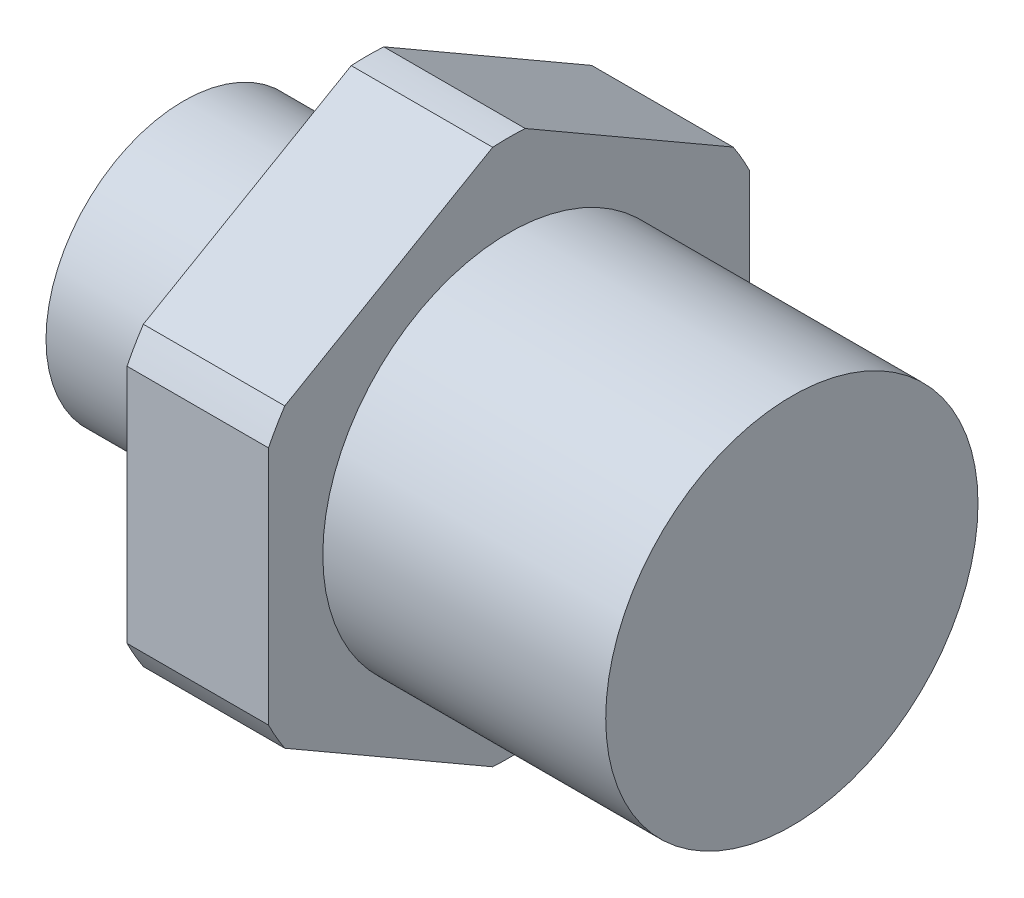
ISO-10303-21;
HEADER;
FILE_DESCRIPTION(('STEP AP214'),'2;1');
FILE_NAME('part.step','',(''),(''),'','','');
FILE_SCHEMA(('AUTOMOTIVE_DESIGN { 1 0 10303 214 1 1 1 1 }'));
ENDSEC;
DATA;
#1=APPLICATION_CONTEXT('core data for automotive mechanical design processes');
#2=APPLICATION_PROTOCOL_DEFINITION('international standard','automotive_design',2000,#1);
#3=PRODUCT_CONTEXT('',#1,'mechanical');
#4=PRODUCT('Part','Part','',(#3));
#5=PRODUCT_RELATED_PRODUCT_CATEGORY('part','',(#4));
#6=PRODUCT_DEFINITION_FORMATION('','',#4);
#7=PRODUCT_DEFINITION_CONTEXT('part definition',#1,'design');
#8=PRODUCT_DEFINITION('design','',#6,#7);
#9=PRODUCT_DEFINITION_SHAPE('','',#8);
#10=(LENGTH_UNIT() NAMED_UNIT(*) SI_UNIT(.MILLI.,.METRE.));
#11=(NAMED_UNIT(*) PLANE_ANGLE_UNIT() SI_UNIT($,.RADIAN.));
#12=(NAMED_UNIT(*) SI_UNIT($,.STERADIAN.) SOLID_ANGLE_UNIT());
#13=UNCERTAINTY_MEASURE_WITH_UNIT(LENGTH_MEASURE(1.E-05),#10,'distance_accuracy_value','');
#14=(GEOMETRIC_REPRESENTATION_CONTEXT(3) GLOBAL_UNCERTAINTY_ASSIGNED_CONTEXT((#13)) GLOBAL_UNIT_ASSIGNED_CONTEXT((#10,
#11,#12)) REPRESENTATION_CONTEXT('',''));
#15=CARTESIAN_POINT('',(0.,0.,0.));
#16=DIRECTION('',(0.,0.,1.));
#17=DIRECTION('',(1.,0.,0.));
#18=AXIS2_PLACEMENT_3D('',#15,#16,#17);
#19=CARTESIAN_POINT('',(0.,0.,0.));
#20=DIRECTION('',(1.,0.,0.));
#21=DIRECTION('',(0.,0.,-1.));
#22=AXIS2_PLACEMENT_3D('',#19,#20,#21);
#23=CYLINDRICAL_SURFACE('',#22,9.5);
#24=DIRECTION('',(1.,0.,0.));
#25=VECTOR('',#24,1.);
#26=CARTESIAN_POINT('',(-15.,-4.24264068711928,8.5));
#27=LINE('',#26,#25);
#28=CARTESIAN_POINT('',(-15.,-4.24264068711928,8.5));
#29=VERTEX_POINT('',#28);
#30=CARTESIAN_POINT('',(-10.,-4.24264068711928,8.5));
#31=VERTEX_POINT('',#30);
#32=EDGE_CURVE('E107',#29,#31,#27,.T.);
#33=ORIENTED_EDGE('',*,*,#32,.F.);
#34=CARTESIAN_POINT('',(-15.,0.,0.));
#35=DIRECTION('',(1.,0.,0.));
#36=DIRECTION('',(0.,-0.446593756538872,0.894736842105263));
#37=AXIS2_PLACEMENT_3D('',#34,#35,#36);
#38=CIRCLE('',#37,9.5);
#39=CARTESIAN_POINT('',(-15.,-5.23989558860806,7.92423461417479));
#40=VERTEX_POINT('',#39);
#41=EDGE_CURVE('E122',#29,#40,#38,.T.);
#42=ORIENTED_EDGE('',*,*,#41,.T.);
#43=DIRECTION('',(-1.,0.,0.));
#44=VECTOR('',#43,1.);
#45=CARTESIAN_POINT('',(-10.,-5.23989558860806,7.92423461417479));
#46=LINE('',#45,#44);
#47=CARTESIAN_POINT('',(-10.,-5.23989558860806,7.92423461417479));
#48=VERTEX_POINT('',#47);
#49=EDGE_CURVE('E128',#48,#40,#46,.T.);
#50=ORIENTED_EDGE('',*,*,#49,.F.);
#51=CARTESIAN_POINT('',(-10.,0.,0.));
#52=DIRECTION('',(1.,0.,0.));
#53=DIRECTION('',(0.,-0.446593756538872,0.894736842105263));
#54=AXIS2_PLACEMENT_3D('',#51,#52,#53);
#55=CIRCLE('',#54,9.5);
#56=EDGE_CURVE('E124',#31,#48,#55,.T.);
#57=ORIENTED_EDGE('',*,*,#56,.F.);
#58=EDGE_LOOP('',(#33,#42,#50,#57));
#59=FACE_BOUND('',#58,.T.);
#60=ADVANCED_FACE('F17',(#59),#23,.T.);
#61=DIRECTION('',(-1.,0.,0.));
#62=VECTOR('',#61,1.);
#63=CARTESIAN_POINT('',(-10.,4.24264068711928,8.5));
#64=LINE('',#63,#62);
#65=CARTESIAN_POINT('',(-10.,4.24264068711928,8.5));
#66=VERTEX_POINT('',#65);
#67=CARTESIAN_POINT('',(-15.,4.24264068711928,8.5));
#68=VERTEX_POINT('',#67);
#69=EDGE_CURVE('E110',#66,#68,#64,.T.);
#70=ORIENTED_EDGE('',*,*,#69,.F.);
#71=CARTESIAN_POINT('',(-10.,0.,0.));
#72=DIRECTION('',(1.,0.,0.));
#73=DIRECTION('',(0.,0.551567956695585,0.834129959386819));
#74=AXIS2_PLACEMENT_3D('',#71,#72,#73);
#75=CIRCLE('',#74,9.5);
#76=CARTESIAN_POINT('',(-10.,5.23989558860806,7.92423461417479));
#77=VERTEX_POINT('',#76);
#78=EDGE_CURVE('E142',#77,#66,#75,.T.);
#79=ORIENTED_EDGE('',*,*,#78,.F.);
#80=DIRECTION('',(1.,0.,0.));
#81=VECTOR('',#80,1.);
#82=CARTESIAN_POINT('',(-15.,5.23989558860806,7.92423461417479));
#83=LINE('',#82,#81);
#84=CARTESIAN_POINT('',(-15.,5.23989558860805,7.92423461417479));
#85=VERTEX_POINT('',#84);
#86=EDGE_CURVE('E147',#85,#77,#83,.T.);
#87=ORIENTED_EDGE('',*,*,#86,.F.);
#88=CARTESIAN_POINT('',(-15.,0.,0.));
#89=DIRECTION('',(1.,0.,0.));
#90=DIRECTION('',(0.,0.551567956695585,0.83412995938682));
#91=AXIS2_PLACEMENT_3D('',#88,#89,#90);
#92=CIRCLE('',#91,9.5);
#93=EDGE_CURVE('E151',#85,#68,#92,.T.);
#94=ORIENTED_EDGE('',*,*,#93,.T.);
#95=EDGE_LOOP('',(#70,#79,#87,#94));
#96=FACE_BOUND('',#95,.T.);
#97=ADVANCED_FACE('F296',(#96),#23,.T.);
#98=DIRECTION('',(-1.,0.,0.));
#99=VECTOR('',#98,1.);
#100=CARTESIAN_POINT('',(-10.,9.48253627572737,0.575765385825165));
#101=LINE('',#100,#99);
#102=CARTESIAN_POINT('',(-10.,9.48253627572737,0.575765385825165));
#103=VERTEX_POINT('',#102);
#104=CARTESIAN_POINT('',(-15.,9.48253627572737,0.575765385825161));
#105=VERTEX_POINT('',#104);
#106=EDGE_CURVE('E155',#103,#105,#101,.T.);
#107=ORIENTED_EDGE('',*,*,#106,.F.);
#108=CARTESIAN_POINT('',(-10.,0.,0.));
#109=DIRECTION('',(1.,0.,0.));
#110=DIRECTION('',(0.,0.998161713234461,-0.0606068827184386));
#111=AXIS2_PLACEMENT_3D('',#108,#109,#110);
#112=CIRCLE('',#111,9.5);
#113=CARTESIAN_POINT('',(-10.,9.48253627572737,-0.575765385825165));
#114=VERTEX_POINT('',#113);
#115=EDGE_CURVE('E159',#114,#103,#112,.T.);
#116=ORIENTED_EDGE('',*,*,#115,.F.);
#117=DIRECTION('',(1.,0.,0.));
#118=VECTOR('',#117,1.);
#119=CARTESIAN_POINT('',(-15.,9.48253627572737,-0.575765385825165));
#120=LINE('',#119,#118);
#121=CARTESIAN_POINT('',(-15.,9.48253627572737,-0.575765385825161));
#122=VERTEX_POINT('',#121);
#123=EDGE_CURVE('E164',#122,#114,#120,.T.);
#124=ORIENTED_EDGE('',*,*,#123,.F.);
#125=CARTESIAN_POINT('',(-15.,0.,0.));
#126=DIRECTION('',(1.,0.,0.));
#127=DIRECTION('',(0.,0.998161713234461,-0.0606068827184381));
#128=AXIS2_PLACEMENT_3D('',#125,#126,#127);
#129=CIRCLE('',#128,9.5);
#130=EDGE_CURVE('E168',#122,#105,#129,.T.);
#131=ORIENTED_EDGE('',*,*,#130,.T.);
#132=EDGE_LOOP('',(#107,#116,#124,#131));
#133=FACE_BOUND('',#132,.T.);
#134=ADVANCED_FACE('F305',(#133),#23,.T.);
#135=DIRECTION('',(-1.,0.,0.));
#136=VECTOR('',#135,1.);
#137=CARTESIAN_POINT('',(-10.,5.23989558860806,-7.92423461417479));
#138=LINE('',#137,#136);
#139=CARTESIAN_POINT('',(-10.,5.23989558860806,-7.92423461417479));
#140=VERTEX_POINT('',#139);
#141=CARTESIAN_POINT('',(-15.,5.23989558860805,-7.92423461417479));
#142=VERTEX_POINT('',#141);
#143=EDGE_CURVE('E173',#140,#142,#138,.T.);
#144=ORIENTED_EDGE('',*,*,#143,.F.);
#145=CARTESIAN_POINT('',(-10.,0.,0.));
#146=DIRECTION('',(1.,0.,0.));
#147=DIRECTION('',(0.,0.446593756538872,-0.894736842105263));
#148=AXIS2_PLACEMENT_3D('',#145,#146,#147);
#149=CIRCLE('',#148,9.5);
#150=CARTESIAN_POINT('',(-10.,4.24264068711928,-8.5));
#151=VERTEX_POINT('',#150);
#152=EDGE_CURVE('E177',#151,#140,#149,.T.);
#153=ORIENTED_EDGE('',*,*,#152,.F.);
#154=DIRECTION('',(1.,0.,0.));
#155=VECTOR('',#154,1.);
#156=CARTESIAN_POINT('',(-15.,4.24264068711928,-8.5));
#157=LINE('',#156,#155);
#158=CARTESIAN_POINT('',(-15.,4.24264068711928,-8.5));
#159=VERTEX_POINT('',#158);
#160=EDGE_CURVE('E182',#159,#151,#157,.T.);
#161=ORIENTED_EDGE('',*,*,#160,.F.);
#162=CARTESIAN_POINT('',(-15.,0.,0.));
#163=DIRECTION('',(1.,0.,0.));
#164=DIRECTION('',(0.,0.446593756538872,-0.894736842105263));
#165=AXIS2_PLACEMENT_3D('',#162,#163,#164);
#166=CIRCLE('',#165,9.5);
#167=EDGE_CURVE('E186',#159,#142,#166,.T.);
#168=ORIENTED_EDGE('',*,*,#167,.T.);
#169=EDGE_LOOP('',(#144,#153,#161,#168));
#170=FACE_BOUND('',#169,.T.);
#171=ADVANCED_FACE('F315',(#170),#23,.T.);
#172=DIRECTION('',(-1.,0.,0.));
#173=VECTOR('',#172,1.);
#174=CARTESIAN_POINT('',(-10.,-4.24264068711928,-8.5));
#175=LINE('',#174,#173);
#176=CARTESIAN_POINT('',(-10.,-4.24264068711928,-8.5));
#177=VERTEX_POINT('',#176);
#178=CARTESIAN_POINT('',(-15.,-4.24264068711928,-8.5));
#179=VERTEX_POINT('',#178);
#180=EDGE_CURVE('E191',#177,#179,#175,.T.);
#181=ORIENTED_EDGE('',*,*,#180,.F.);
#182=CARTESIAN_POINT('',(-10.,0.,0.));
#183=DIRECTION('',(1.,0.,0.));
#184=DIRECTION('',(0.,-0.551567956695586,-0.834129959386819));
#185=AXIS2_PLACEMENT_3D('',#182,#183,#184);
#186=CIRCLE('',#185,9.5);
#187=CARTESIAN_POINT('',(-10.,-5.23989558860806,-7.92423461417479));
#188=VERTEX_POINT('',#187);
#189=EDGE_CURVE('E195',#188,#177,#186,.T.);
#190=ORIENTED_EDGE('',*,*,#189,.F.);
#191=DIRECTION('',(1.,0.,0.));
#192=VECTOR('',#191,1.);
#193=CARTESIAN_POINT('',(-15.,-5.23989558860806,-7.92423461417479));
#194=LINE('',#193,#192);
#195=CARTESIAN_POINT('',(-15.,-5.23989558860806,-7.92423461417479));
#196=VERTEX_POINT('',#195);
#197=EDGE_CURVE('E200',#196,#188,#194,.T.);
#198=ORIENTED_EDGE('',*,*,#197,.F.);
#199=CARTESIAN_POINT('',(-15.,0.,0.));
#200=DIRECTION('',(1.,0.,0.));
#201=DIRECTION('',(0.,-0.551567956695586,-0.834129959386819));
#202=AXIS2_PLACEMENT_3D('',#199,#200,#201);
#203=CIRCLE('',#202,9.5);
#204=EDGE_CURVE('E204',#196,#179,#203,.T.);
#205=ORIENTED_EDGE('',*,*,#204,.T.);
#206=EDGE_LOOP('',(#181,#190,#198,#205));
#207=FACE_BOUND('',#206,.T.);
#208=ADVANCED_FACE('F323',(#207),#23,.T.);
#209=DIRECTION('',(-1.,0.,0.));
#210=VECTOR('',#209,1.);
#211=CARTESIAN_POINT('',(-10.,-9.48253627572737,-0.575765385825165));
#212=LINE('',#211,#210);
#213=CARTESIAN_POINT('',(-10.,-9.48253627572737,-0.575765385825165));
#214=VERTEX_POINT('',#213);
#215=CARTESIAN_POINT('',(-15.,-9.48253627572737,-0.575765385825168));
#216=VERTEX_POINT('',#215);
#217=EDGE_CURVE('E32',#214,#216,#212,.T.);
#218=ORIENTED_EDGE('',*,*,#217,.F.);
#219=CARTESIAN_POINT('',(-10.,0.,0.));
#220=DIRECTION('',(1.,0.,0.));
#221=DIRECTION('',(0.,-0.998161713234461,0.0606068827184389));
#222=AXIS2_PLACEMENT_3D('',#219,#220,#221);
#223=CIRCLE('',#222,9.5);
#224=CARTESIAN_POINT('',(-10.,-9.48253627572737,0.575765385825165));
#225=VERTEX_POINT('',#224);
#226=EDGE_CURVE('E212',#225,#214,#223,.T.);
#227=ORIENTED_EDGE('',*,*,#226,.F.);
#228=DIRECTION('',(1.,0.,0.));
#229=VECTOR('',#228,1.);
#230=CARTESIAN_POINT('',(-15.,-9.48253627572737,0.575765385825165));
#231=LINE('',#230,#229);
#232=CARTESIAN_POINT('',(-15.,-9.48253627572737,0.575765385825165));
#233=VERTEX_POINT('',#232);
#234=EDGE_CURVE('E217',#233,#225,#231,.T.);
#235=ORIENTED_EDGE('',*,*,#234,.F.);
#236=CARTESIAN_POINT('',(-15.,0.,0.));
#237=DIRECTION('',(1.,0.,0.));
#238=DIRECTION('',(0.,-0.998161713234461,0.0606068827184389));
#239=AXIS2_PLACEMENT_3D('',#236,#237,#238);
#240=CIRCLE('',#239,9.5);
#241=EDGE_CURVE('E221',#233,#216,#240,.T.);
#242=ORIENTED_EDGE('',*,*,#241,.T.);
#243=EDGE_LOOP('',(#218,#227,#235,#242));
#244=FACE_BOUND('',#243,.T.);
#245=ADVANCED_FACE('F290',(#244),#23,.T.);
#246=CARTESIAN_POINT('',(-10.,9.5,0.));
#247=DIRECTION('',(-1.,0.,0.));
#248=DIRECTION('',(0.,0.,1.));
#249=AXIS2_PLACEMENT_3D('',#246,#247,#248);
#250=PLANE('',#249);
#251=CARTESIAN_POINT('',(-10.,0.,0.));
#252=DIRECTION('',(1.,0.,0.));
#253=DIRECTION('',(0.,0.,-1.));
#254=AXIS2_PLACEMENT_3D('',#251,#252,#253);
#255=CIRCLE('',#254,6.58);
#256=CARTESIAN_POINT('',(-10.,0.,-6.58));
#257=VERTEX_POINT('',#256);
#258=EDGE_CURVE('E226',#257,#257,#255,.T.);
#259=ORIENTED_EDGE('',*,*,#258,.F.);
#260=EDGE_LOOP('',(#259));
#261=FACE_BOUND('',#260,.T.);
#262=DIRECTION('',(0.,1.,0.));
#263=VECTOR('',#262,1.);
#264=CARTESIAN_POINT('',(-10.,-4.24264068711928,8.5));
#265=LINE('',#264,#263);
#266=EDGE_CURVE('E231',#31,#66,#265,.T.);
#267=ORIENTED_EDGE('',*,*,#266,.F.);
#268=ORIENTED_EDGE('',*,*,#56,.T.);
#269=DIRECTION('',(0.,0.499999999999999,0.866025403784439));
#270=VECTOR('',#269,1.);
#271=CARTESIAN_POINT('',(-10.,-9.48253627572738,0.575765385825172));
#272=LINE('',#271,#270);
#273=EDGE_CURVE('E233',#225,#48,#272,.T.);
#274=ORIENTED_EDGE('',*,*,#273,.F.);
#275=ORIENTED_EDGE('',*,*,#226,.T.);
#276=DIRECTION('',(0.,-0.499999999999999,0.866025403784439));
#277=VECTOR('',#276,1.);
#278=CARTESIAN_POINT('',(-10.,-5.23989558860806,-7.92423461417479));
#279=LINE('',#278,#277);
#280=EDGE_CURVE('E237',#188,#214,#279,.T.);
#281=ORIENTED_EDGE('',*,*,#280,.F.);
#282=ORIENTED_EDGE('',*,*,#189,.T.);
#283=DIRECTION('',(0.,-1.,0.));
#284=VECTOR('',#283,1.);
#285=CARTESIAN_POINT('',(-10.,4.24264068711928,-8.5));
#286=LINE('',#285,#284);
#287=EDGE_CURVE('E241',#151,#177,#286,.T.);
#288=ORIENTED_EDGE('',*,*,#287,.F.);
#289=ORIENTED_EDGE('',*,*,#152,.T.);
#290=DIRECTION('',(0.,-0.499999999999999,-0.866025403784439));
#291=VECTOR('',#290,1.);
#292=CARTESIAN_POINT('',(-10.,9.48253627572737,-0.575765385825167));
#293=LINE('',#292,#291);
#294=EDGE_CURVE('E245',#114,#140,#293,.T.);
#295=ORIENTED_EDGE('',*,*,#294,.F.);
#296=ORIENTED_EDGE('',*,*,#115,.T.);
#297=DIRECTION('',(0.,0.499999999999999,-0.866025403784439));
#298=VECTOR('',#297,1.);
#299=CARTESIAN_POINT('',(-10.,5.23989558860805,7.92423461417478));
#300=LINE('',#299,#298);
#301=EDGE_CURVE('E249',#77,#103,#300,.T.);
#302=ORIENTED_EDGE('',*,*,#301,.F.);
#303=ORIENTED_EDGE('',*,*,#78,.T.);
#304=EDGE_LOOP('',(#267,#268,#274,#275,#281,#282,#288,#289,#295,#296,#302,#303));
#305=FACE_BOUND('',#304,.T.);
#306=ADVANCED_FACE('F287',(#261,#305),#250,.F.);
#307=CARTESIAN_POINT('',(-15.,4.865,0.));
#308=DIRECTION('',(1.,0.,0.));
#309=DIRECTION('',(0.,0.,-1.));
#310=AXIS2_PLACEMENT_3D('',#307,#308,#309);
#311=PLANE('',#310);
#312=CARTESIAN_POINT('',(-15.,0.,0.));
#313=DIRECTION('',(1.,0.,0.));
#314=DIRECTION('',(0.,0.,-1.));
#315=AXIS2_PLACEMENT_3D('',#312,#313,#314);
#316=CIRCLE('',#315,4.865);
#317=CARTESIAN_POINT('',(-15.,0.,-4.865));
#318=VERTEX_POINT('',#317);
#319=EDGE_CURVE('E116',#318,#318,#316,.T.);
#320=ORIENTED_EDGE('',*,*,#319,.T.);
#321=EDGE_LOOP('',(#320));
#322=FACE_BOUND('',#321,.T.);
#323=DIRECTION('',(0.,-1.,0.));
#324=VECTOR('',#323,1.);
#325=CARTESIAN_POINT('',(-15.,4.24264068711929,8.5));
#326=LINE('',#325,#324);
#327=EDGE_CURVE('E105',#68,#29,#326,.T.);
#328=ORIENTED_EDGE('',*,*,#327,.F.);
#329=ORIENTED_EDGE('',*,*,#93,.F.);
#330=DIRECTION('',(0.,-0.5,0.866025403784439));
#331=VECTOR('',#330,1.);
#332=CARTESIAN_POINT('',(-15.,9.48253627572738,0.575765385825167));
#333=LINE('',#332,#331);
#334=EDGE_CURVE('E115',#105,#85,#333,.T.);
#335=ORIENTED_EDGE('',*,*,#334,.F.);
#336=ORIENTED_EDGE('',*,*,#130,.F.);
#337=DIRECTION('',(0.,0.5,0.866025403784439));
#338=VECTOR('',#337,1.);
#339=CARTESIAN_POINT('',(-15.,5.23989558860805,-7.92423461417479));
#340=LINE('',#339,#338);
#341=EDGE_CURVE('E260',#142,#122,#340,.T.);
#342=ORIENTED_EDGE('',*,*,#341,.F.);
#343=ORIENTED_EDGE('',*,*,#167,.F.);
#344=DIRECTION('',(0.,1.,0.));
#345=VECTOR('',#344,1.);
#346=CARTESIAN_POINT('',(-15.,-4.24264068711929,-8.5));
#347=LINE('',#346,#345);
#348=EDGE_CURVE('E264',#179,#159,#347,.T.);
#349=ORIENTED_EDGE('',*,*,#348,.F.);
#350=ORIENTED_EDGE('',*,*,#204,.F.);
#351=DIRECTION('',(0.,0.499999999999999,-0.866025403784439));
#352=VECTOR('',#351,1.);
#353=CARTESIAN_POINT('',(-15.,-9.48253627572738,-0.575765385825171));
#354=LINE('',#353,#352);
#355=EDGE_CURVE('E268',#216,#196,#354,.T.);
#356=ORIENTED_EDGE('',*,*,#355,.F.);
#357=ORIENTED_EDGE('',*,*,#241,.F.);
#358=DIRECTION('',(0.,-0.5,-0.866025403784439));
#359=VECTOR('',#358,1.);
#360=CARTESIAN_POINT('',(-15.,-5.23989558860805,7.92423461417478));
#361=LINE('',#360,#359);
#362=EDGE_CURVE('E40',#40,#233,#361,.T.);
#363=ORIENTED_EDGE('',*,*,#362,.F.);
#364=ORIENTED_EDGE('',*,*,#41,.F.);
#365=EDGE_LOOP('',(#328,#329,#335,#336,#342,#343,#349,#350,#356,#357,#363,#364));
#366=FACE_BOUND('',#365,.T.);
#367=ADVANCED_FACE('F126',(#322,#366),#311,.F.);
#368=CARTESIAN_POINT('',(50.,0.,0.));
#369=DIRECTION('',(1.,0.,0.));
#370=DIRECTION('',(0.,0.,-1.));
#371=AXIS2_PLACEMENT_3D('',#368,#369,#370);
#372=CYLINDRICAL_SURFACE('',#371,6.58);
#373=CARTESIAN_POINT('',(0.,0.,0.));
#374=DIRECTION('',(1.,0.,0.));
#375=DIRECTION('',(0.,0.,-1.));
#376=AXIS2_PLACEMENT_3D('',#373,#374,#375);
#377=CIRCLE('',#376,6.58);
#378=CARTESIAN_POINT('',(0.,0.,-6.58));
#379=VERTEX_POINT('',#378);
#380=EDGE_CURVE('E25',#379,#379,#377,.T.);
#381=ORIENTED_EDGE('',*,*,#380,.F.);
#382=EDGE_LOOP('',(#381));
#383=FACE_BOUND('',#382,.T.);
#384=ORIENTED_EDGE('',*,*,#258,.T.);
#385=EDGE_LOOP('',(#384));
#386=FACE_BOUND('',#385,.T.);
#387=ADVANCED_FACE('F281',(#383,#386),#372,.T.);
#388=CARTESIAN_POINT('',(0.,9.5,0.));
#389=DIRECTION('',(-1.,0.,0.));
#390=DIRECTION('',(0.,0.,1.));
#391=AXIS2_PLACEMENT_3D('',#388,#389,#390);
#392=PLANE('',#391);
#393=ORIENTED_EDGE('',*,*,#380,.T.);
#394=EDGE_LOOP('',(#393));
#395=FACE_BOUND('',#394,.T.);
#396=ADVANCED_FACE('F279',(#395),#392,.F.);
#397=CARTESIAN_POINT('',(50.,0.,0.));
#398=DIRECTION('',(1.,0.,0.));
#399=DIRECTION('',(0.,0.,-1.));
#400=AXIS2_PLACEMENT_3D('',#397,#398,#399);
#401=CYLINDRICAL_SURFACE('',#400,4.865);
#402=ORIENTED_EDGE('',*,*,#319,.F.);
#403=EDGE_LOOP('',(#402));
#404=FACE_BOUND('',#403,.T.);
#405=CARTESIAN_POINT('',(-21.5,0.,0.));
#406=DIRECTION('',(1.,0.,0.));
#407=DIRECTION('',(0.,0.,-1.));
#408=AXIS2_PLACEMENT_3D('',#405,#406,#407);
#409=CIRCLE('',#408,4.865);
#410=CARTESIAN_POINT('',(-21.5,0.,-4.865));
#411=VERTEX_POINT('',#410);
#412=EDGE_CURVE('E11',#411,#411,#409,.T.);
#413=ORIENTED_EDGE('',*,*,#412,.T.);
#414=EDGE_LOOP('',(#413));
#415=FACE_BOUND('',#414,.T.);
#416=ADVANCED_FACE('F340',(#404,#415),#401,.T.);
#417=CARTESIAN_POINT('',(-21.5,0.,0.));
#418=DIRECTION('',(1.,0.,0.));
#419=DIRECTION('',(0.,0.,-1.));
#420=AXIS2_PLACEMENT_3D('',#417,#418,#419);
#421=PLANE('',#420);
#422=ORIENTED_EDGE('',*,*,#412,.F.);
#423=EDGE_LOOP('',(#422));
#424=FACE_BOUND('',#423,.T.);
#425=ADVANCED_FACE('F331',(#424),#421,.F.);
#426=CARTESIAN_POINT('',(-21.5,-4.9074772881118,8.5));
#427=DIRECTION('',(0.,-0.866025403784439,0.499999999999999));
#428=DIRECTION('',(0.,-0.499999999999999,-0.866025403784439));
#429=AXIS2_PLACEMENT_3D('',#426,#427,#428);
#430=PLANE('',#429);
#431=ORIENTED_EDGE('',*,*,#273,.T.);
#432=ORIENTED_EDGE('',*,*,#49,.T.);
#433=ORIENTED_EDGE('',*,*,#362,.T.);
#434=ORIENTED_EDGE('',*,*,#234,.T.);
#435=EDGE_LOOP('',(#431,#432,#433,#434));
#436=FACE_BOUND('',#435,.T.);
#437=ADVANCED_FACE('F329',(#436),#430,.T.);
#438=CARTESIAN_POINT('',(-21.5,-9.8149545762236,0.));
#439=DIRECTION('',(0.,-0.866025403784439,-0.499999999999999));
#440=DIRECTION('',(0.,0.499999999999999,-0.866025403784439));
#441=AXIS2_PLACEMENT_3D('',#438,#439,#440);
#442=PLANE('',#441);
#443=ORIENTED_EDGE('',*,*,#280,.T.);
#444=ORIENTED_EDGE('',*,*,#217,.T.);
#445=ORIENTED_EDGE('',*,*,#355,.T.);
#446=ORIENTED_EDGE('',*,*,#197,.T.);
#447=EDGE_LOOP('',(#443,#444,#445,#446));
#448=FACE_BOUND('',#447,.T.);
#449=ADVANCED_FACE('F326',(#448),#442,.T.);
#450=CARTESIAN_POINT('',(-21.5,-4.9074772881118,-8.5));
#451=DIRECTION('',(0.,0.,-1.));
#452=DIRECTION('',(-1.,0.,0.));
#453=AXIS2_PLACEMENT_3D('',#450,#451,#452);
#454=PLANE('',#453);
#455=ORIENTED_EDGE('',*,*,#287,.T.);
#456=ORIENTED_EDGE('',*,*,#180,.T.);
#457=ORIENTED_EDGE('',*,*,#348,.T.);
#458=ORIENTED_EDGE('',*,*,#160,.T.);
#459=EDGE_LOOP('',(#455,#456,#457,#458));
#460=FACE_BOUND('',#459,.T.);
#461=ADVANCED_FACE('F338',(#460),#454,.T.);
#462=CARTESIAN_POINT('',(-21.5,4.9074772881118,-8.5));
#463=DIRECTION('',(0.,0.866025403784439,-0.499999999999999));
#464=DIRECTION('',(0.,0.499999999999999,0.866025403784439));
#465=AXIS2_PLACEMENT_3D('',#462,#463,#464);
#466=PLANE('',#465);
#467=ORIENTED_EDGE('',*,*,#294,.T.);
#468=ORIENTED_EDGE('',*,*,#143,.T.);
#469=ORIENTED_EDGE('',*,*,#341,.T.);
#470=ORIENTED_EDGE('',*,*,#123,.T.);
#471=EDGE_LOOP('',(#467,#468,#469,#470));
#472=FACE_BOUND('',#471,.T.);
#473=ADVANCED_FACE('F309',(#472),#466,.T.);
#474=CARTESIAN_POINT('',(-21.5,9.8149545762236,0.));
#475=DIRECTION('',(0.,0.866025403784439,0.499999999999999));
#476=DIRECTION('',(0.,-0.499999999999999,0.866025403784439));
#477=AXIS2_PLACEMENT_3D('',#474,#475,#476);
#478=PLANE('',#477);
#479=ORIENTED_EDGE('',*,*,#301,.T.);
#480=ORIENTED_EDGE('',*,*,#106,.T.);
#481=ORIENTED_EDGE('',*,*,#334,.T.);
#482=ORIENTED_EDGE('',*,*,#86,.T.);
#483=EDGE_LOOP('',(#479,#480,#481,#482));
#484=FACE_BOUND('',#483,.T.);
#485=ADVANCED_FACE('F474',(#484),#478,.T.);
#486=CARTESIAN_POINT('',(-21.5,4.9074772881118,8.5));
#487=DIRECTION('',(0.,0.,1.));
#488=DIRECTION('',(1.,0.,0.));
#489=AXIS2_PLACEMENT_3D('',#486,#487,#488);
#490=PLANE('',#489);
#491=ORIENTED_EDGE('',*,*,#266,.T.);
#492=ORIENTED_EDGE('',*,*,#69,.T.);
#493=ORIENTED_EDGE('',*,*,#327,.T.);
#494=ORIENTED_EDGE('',*,*,#32,.T.);
#495=EDGE_LOOP('',(#491,#492,#493,#494));
#496=FACE_BOUND('',#495,.T.);
#497=ADVANCED_FACE('F19',(#496),#490,.T.);
#498=CLOSED_SHELL('',(#60,#97,#134,#171,#208,#245,#306,#367,#387,#396,#416,#425,#437,#449,#461,
#473,#485,#497));
#499=MANIFOLD_SOLID_BREP('B1',#498);
#500=ADVANCED_BREP_SHAPE_REPRESENTATION('',(#18,#499),#14);
#501=SHAPE_DEFINITION_REPRESENTATION(#9,#500);
ENDSEC;
END-ISO-10303-21;
